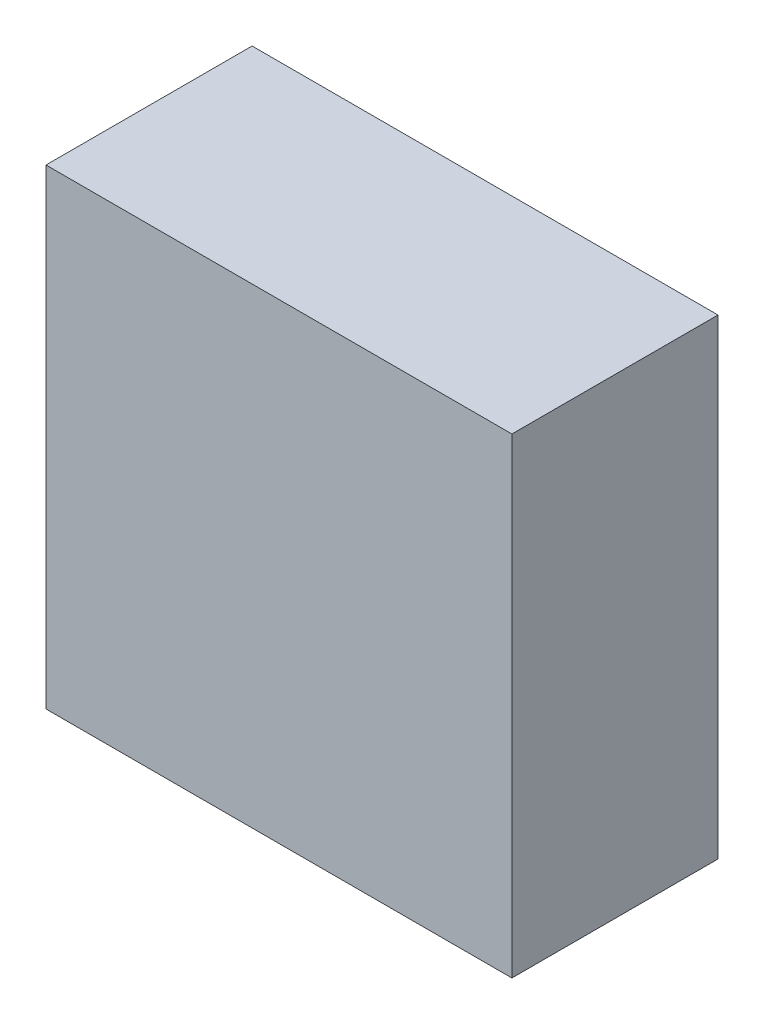
ISO-10303-21;
HEADER;
FILE_DESCRIPTION(('STEP AP214'),'2;1');
FILE_NAME('part.step','',(''),(''),'','','');
FILE_SCHEMA(('AUTOMOTIVE_DESIGN { 1 0 10303 214 1 1 1 1 }'));
ENDSEC;
DATA;
#1=APPLICATION_CONTEXT('core data for automotive mechanical design processes');
#2=APPLICATION_PROTOCOL_DEFINITION('international standard','automotive_design',2000,#1);
#3=PRODUCT_CONTEXT('',#1,'mechanical');
#4=PRODUCT('Part','Part','',(#3));
#5=PRODUCT_RELATED_PRODUCT_CATEGORY('part','',(#4));
#6=PRODUCT_DEFINITION_FORMATION('','',#4);
#7=PRODUCT_DEFINITION_CONTEXT('part definition',#1,'design');
#8=PRODUCT_DEFINITION('design','',#6,#7);
#9=PRODUCT_DEFINITION_SHAPE('','',#8);
#10=(LENGTH_UNIT() NAMED_UNIT(*) SI_UNIT(.MILLI.,.METRE.));
#11=(NAMED_UNIT(*) PLANE_ANGLE_UNIT() SI_UNIT($,.RADIAN.));
#12=(NAMED_UNIT(*) SI_UNIT($,.STERADIAN.) SOLID_ANGLE_UNIT());
#13=UNCERTAINTY_MEASURE_WITH_UNIT(LENGTH_MEASURE(1.E-05),#10,'distance_accuracy_value','');
#14=(GEOMETRIC_REPRESENTATION_CONTEXT(3) GLOBAL_UNCERTAINTY_ASSIGNED_CONTEXT((#13)) GLOBAL_UNIT_ASSIGNED_CONTEXT((#10,
#11,#12)) REPRESENTATION_CONTEXT('',''));
#15=CARTESIAN_POINT('',(0.,0.,0.));
#16=DIRECTION('',(0.,0.,1.));
#17=DIRECTION('',(1.,0.,0.));
#18=AXIS2_PLACEMENT_3D('',#15,#16,#17);
#19=CARTESIAN_POINT('',(0.,0.,1.));
#20=DIRECTION('',(1.,0.,0.));
#21=DIRECTION('',(0.,0.,-1.));
#22=AXIS2_PLACEMENT_3D('',#19,#20,#21);
#23=PLANE('',#22);
#24=DIRECTION('',(0.,-1.,0.));
#25=VECTOR('',#24,1.);
#26=CARTESIAN_POINT('',(0.,0.,0.));
#27=LINE('',#26,#25);
#28=CARTESIAN_POINT('',(0.,2.286,0.));
#29=VERTEX_POINT('',#28);
#30=CARTESIAN_POINT('',(0.,0.,0.));
#31=VERTEX_POINT('',#30);
#32=EDGE_CURVE('E95',#29,#31,#27,.T.);
#33=ORIENTED_EDGE('',*,*,#32,.T.);
#34=DIRECTION('',(0.,0.,-1.));
#35=VECTOR('',#34,1.);
#36=CARTESIAN_POINT('',(0.,0.,1.));
#37=LINE('',#36,#35);
#38=CARTESIAN_POINT('',(0.,0.,1.));
#39=VERTEX_POINT('',#38);
#40=EDGE_CURVE('E11',#39,#31,#37,.T.);
#41=ORIENTED_EDGE('',*,*,#40,.F.);
#42=DIRECTION('',(0.,-1.,0.));
#43=VECTOR('',#42,1.);
#44=CARTESIAN_POINT('',(0.,0.,1.));
#45=LINE('',#44,#43);
#46=CARTESIAN_POINT('',(0.,2.286,1.));
#47=VERTEX_POINT('',#46);
#48=EDGE_CURVE('E83',#47,#39,#45,.T.);
#49=ORIENTED_EDGE('',*,*,#48,.F.);
#50=DIRECTION('',(0.,0.,-1.));
#51=VECTOR('',#50,1.);
#52=CARTESIAN_POINT('',(0.,2.286,1.));
#53=LINE('',#52,#51);
#54=EDGE_CURVE('E91',#47,#29,#53,.T.);
#55=ORIENTED_EDGE('',*,*,#54,.T.);
#56=EDGE_LOOP('',(#33,#41,#49,#55));
#57=FACE_BOUND('',#56,.T.);
#58=ADVANCED_FACE('F32',(#57),#23,.F.);
#59=CARTESIAN_POINT('',(2.2606,0.,1.));
#60=DIRECTION('',(0.,1.,0.));
#61=DIRECTION('',(0.,0.,1.));
#62=AXIS2_PLACEMENT_3D('',#59,#60,#61);
#63=PLANE('',#62);
#64=DIRECTION('',(1.,0.,0.));
#65=VECTOR('',#64,1.);
#66=CARTESIAN_POINT('',(2.2606,0.,0.));
#67=LINE('',#66,#65);
#68=CARTESIAN_POINT('',(2.2606,0.,0.));
#69=VERTEX_POINT('',#68);
#70=EDGE_CURVE('E87',#31,#69,#67,.T.);
#71=ORIENTED_EDGE('',*,*,#70,.T.);
#72=DIRECTION('',(0.,0.,-1.));
#73=VECTOR('',#72,1.);
#74=CARTESIAN_POINT('',(2.2606,0.,1.));
#75=LINE('',#74,#73);
#76=CARTESIAN_POINT('',(2.2606,0.,1.));
#77=VERTEX_POINT('',#76);
#78=EDGE_CURVE('E40',#77,#69,#75,.T.);
#79=ORIENTED_EDGE('',*,*,#78,.F.);
#80=DIRECTION('',(1.,0.,0.));
#81=VECTOR('',#80,1.);
#82=CARTESIAN_POINT('',(2.2606,0.,1.));
#83=LINE('',#82,#81);
#84=EDGE_CURVE('E78',#39,#77,#83,.T.);
#85=ORIENTED_EDGE('',*,*,#84,.F.);
#86=ORIENTED_EDGE('',*,*,#40,.T.);
#87=EDGE_LOOP('',(#71,#79,#85,#86));
#88=FACE_BOUND('',#87,.T.);
#89=ADVANCED_FACE('F86',(#88),#63,.F.);
#90=CARTESIAN_POINT('',(2.2606,2.286,1.));
#91=DIRECTION('',(-1.,0.,0.));
#92=DIRECTION('',(0.,0.,1.));
#93=AXIS2_PLACEMENT_3D('',#90,#91,#92);
#94=PLANE('',#93);
#95=DIRECTION('',(0.,1.,0.));
#96=VECTOR('',#95,1.);
#97=CARTESIAN_POINT('',(2.2606,2.286,0.));
#98=LINE('',#97,#96);
#99=CARTESIAN_POINT('',(2.2606,2.286,0.));
#100=VERTEX_POINT('',#99);
#101=EDGE_CURVE('E65',#69,#100,#98,.T.);
#102=ORIENTED_EDGE('',*,*,#101,.T.);
#103=DIRECTION('',(0.,0.,-1.));
#104=VECTOR('',#103,1.);
#105=CARTESIAN_POINT('',(2.2606,2.286,1.));
#106=LINE('',#105,#104);
#107=CARTESIAN_POINT('',(2.2606,2.286,1.));
#108=VERTEX_POINT('',#107);
#109=EDGE_CURVE('E88',#108,#100,#106,.T.);
#110=ORIENTED_EDGE('',*,*,#109,.F.);
#111=DIRECTION('',(0.,1.,0.));
#112=VECTOR('',#111,1.);
#113=CARTESIAN_POINT('',(2.2606,2.286,1.));
#114=LINE('',#113,#112);
#115=EDGE_CURVE('E81',#77,#108,#114,.T.);
#116=ORIENTED_EDGE('',*,*,#115,.F.);
#117=ORIENTED_EDGE('',*,*,#78,.T.);
#118=EDGE_LOOP('',(#102,#110,#116,#117));
#119=FACE_BOUND('',#118,.T.);
#120=ADVANCED_FACE('F89',(#119),#94,.F.);
#121=CARTESIAN_POINT('',(0.,2.286,1.));
#122=DIRECTION('',(0.,-1.,0.));
#123=DIRECTION('',(0.,0.,-1.));
#124=AXIS2_PLACEMENT_3D('',#121,#122,#123);
#125=PLANE('',#124);
#126=DIRECTION('',(-1.,0.,0.));
#127=VECTOR('',#126,1.);
#128=CARTESIAN_POINT('',(0.,2.286,0.));
#129=LINE('',#128,#127);
#130=EDGE_CURVE('E71',#100,#29,#129,.T.);
#131=ORIENTED_EDGE('',*,*,#130,.T.);
#132=ORIENTED_EDGE('',*,*,#54,.F.);
#133=DIRECTION('',(-1.,0.,0.));
#134=VECTOR('',#133,1.);
#135=CARTESIAN_POINT('',(0.,2.286,1.));
#136=LINE('',#135,#134);
#137=EDGE_CURVE('E48',#108,#47,#136,.T.);
#138=ORIENTED_EDGE('',*,*,#137,.F.);
#139=ORIENTED_EDGE('',*,*,#109,.T.);
#140=EDGE_LOOP('',(#131,#132,#138,#139));
#141=FACE_BOUND('',#140,.T.);
#142=ADVANCED_FACE('F102',(#141),#125,.F.);
#143=CARTESIAN_POINT('',(0.,0.,1.));
#144=DIRECTION('',(0.,0.,-1.));
#145=DIRECTION('',(-1.,0.,0.));
#146=AXIS2_PLACEMENT_3D('',#143,#144,#145);
#147=PLANE('',#146);
#148=ORIENTED_EDGE('',*,*,#48,.T.);
#149=ORIENTED_EDGE('',*,*,#84,.T.);
#150=ORIENTED_EDGE('',*,*,#115,.T.);
#151=ORIENTED_EDGE('',*,*,#137,.T.);
#152=EDGE_LOOP('',(#148,#149,#150,#151));
#153=FACE_BOUND('',#152,.T.);
#154=ADVANCED_FACE('F79',(#153),#147,.F.);
#155=CARTESIAN_POINT('',(0.,0.,0.));
#156=DIRECTION('',(0.,0.,-1.));
#157=DIRECTION('',(-1.,0.,0.));
#158=AXIS2_PLACEMENT_3D('',#155,#156,#157);
#159=PLANE('',#158);
#160=ORIENTED_EDGE('',*,*,#32,.F.);
#161=ORIENTED_EDGE('',*,*,#130,.F.);
#162=ORIENTED_EDGE('',*,*,#101,.F.);
#163=ORIENTED_EDGE('',*,*,#70,.F.);
#164=EDGE_LOOP('',(#160,#161,#162,#163));
#165=FACE_BOUND('',#164,.T.);
#166=ADVANCED_FACE('F105',(#165),#159,.T.);
#167=CLOSED_SHELL('',(#58,#89,#120,#142,#154,#166));
#168=MANIFOLD_SOLID_BREP('B2',#167);
#169=ADVANCED_BREP_SHAPE_REPRESENTATION('',(#18,#168),#14);
#170=SHAPE_DEFINITION_REPRESENTATION(#9,#169);
ENDSEC;
END-ISO-10303-21;
